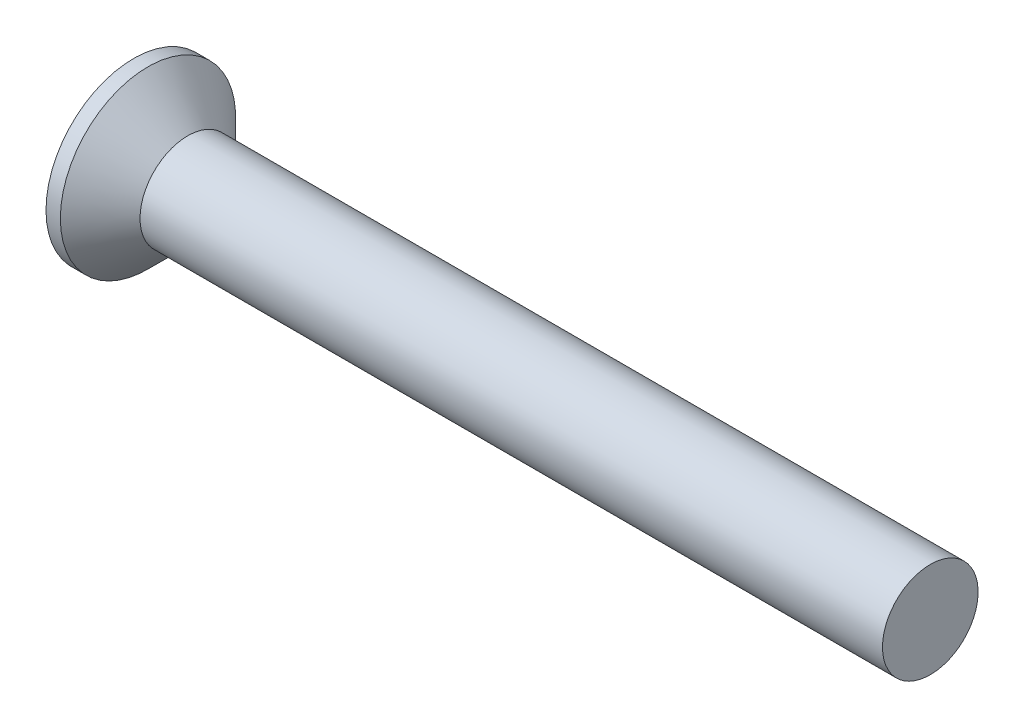
ISO-10303-21;
HEADER;
FILE_DESCRIPTION(('STEP AP214'),'2;1');
FILE_NAME('part.step','',(''),(''),'','','');
FILE_SCHEMA(('AUTOMOTIVE_DESIGN { 1 0 10303 214 1 1 1 1 }'));
ENDSEC;
DATA;
#1=APPLICATION_CONTEXT('core data for automotive mechanical design processes');
#2=APPLICATION_PROTOCOL_DEFINITION('international standard','automotive_design',2000,#1);
#3=PRODUCT_CONTEXT('',#1,'mechanical');
#4=PRODUCT('Part','Part','',(#3));
#5=PRODUCT_RELATED_PRODUCT_CATEGORY('part','',(#4));
#6=PRODUCT_DEFINITION_FORMATION('','',#4);
#7=PRODUCT_DEFINITION_CONTEXT('part definition',#1,'design');
#8=PRODUCT_DEFINITION('design','',#6,#7);
#9=PRODUCT_DEFINITION_SHAPE('','',#8);
#10=(LENGTH_UNIT() NAMED_UNIT(*) SI_UNIT(.MILLI.,.METRE.));
#11=(NAMED_UNIT(*) PLANE_ANGLE_UNIT() SI_UNIT($,.RADIAN.));
#12=(NAMED_UNIT(*) SI_UNIT($,.STERADIAN.) SOLID_ANGLE_UNIT());
#13=UNCERTAINTY_MEASURE_WITH_UNIT(LENGTH_MEASURE(1.E-05),#10,'distance_accuracy_value','');
#14=(GEOMETRIC_REPRESENTATION_CONTEXT(3) GLOBAL_UNCERTAINTY_ASSIGNED_CONTEXT((#13)) GLOBAL_UNIT_ASSIGNED_CONTEXT((#10,
#11,#12)) REPRESENTATION_CONTEXT('',''));
#15=CARTESIAN_POINT('',(0.,0.,0.));
#16=DIRECTION('',(0.,0.,1.));
#17=DIRECTION('',(1.,0.,0.));
#18=AXIS2_PLACEMENT_3D('',#15,#16,#17);
#19=CARTESIAN_POINT('',(0.,0.,0.));
#20=DIRECTION('',(-1.,0.,0.));
#21=DIRECTION('',(0.,0.,1.));
#22=AXIS2_PLACEMENT_3D('',#19,#20,#21);
#23=PLANE('',#22);
#24=CARTESIAN_POINT('',(0.,0.,0.));
#25=DIRECTION('',(-1.,0.,0.));
#26=DIRECTION('',(0.,0.,1.));
#27=AXIS2_PLACEMENT_3D('',#24,#25,#26);
#28=CIRCLE('',#27,2.75);
#29=CARTESIAN_POINT('',(0.,0.,2.75));
#30=VERTEX_POINT('',#29);
#31=EDGE_CURVE('E128',#30,#30,#28,.T.);
#32=ORIENTED_EDGE('',*,*,#31,.T.);
#33=EDGE_LOOP('',(#32));
#34=FACE_BOUND('',#33,.T.);
#35=DIRECTION('',(0.,1.,0.));
#36=VECTOR('',#35,1.);
#37=CARTESIAN_POINT('',(0.,-1.55,-0.395));
#38=LINE('',#37,#36);
#39=CARTESIAN_POINT('',(0.,-1.55,-0.395));
#40=VERTEX_POINT('',#39);
#41=CARTESIAN_POINT('',(0.,-0.394999999999999,-0.395));
#42=VERTEX_POINT('',#41);
#43=EDGE_CURVE('E103',#40,#42,#38,.T.);
#44=ORIENTED_EDGE('',*,*,#43,.T.);
#45=DIRECTION('',(0.,0.,-1.));
#46=VECTOR('',#45,1.);
#47=CARTESIAN_POINT('',(0.,-0.395000000000005,1.55));
#48=LINE('',#47,#46);
#49=CARTESIAN_POINT('',(0.,-0.394999999999995,-1.55));
#50=VERTEX_POINT('',#49);
#51=EDGE_CURVE('E83',#42,#50,#48,.T.);
#52=ORIENTED_EDGE('',*,*,#51,.T.);
#53=DIRECTION('',(0.,1.,0.));
#54=VECTOR('',#53,1.);
#55=CARTESIAN_POINT('',(0.,-0.394999999999995,-1.55));
#56=LINE('',#55,#54);
#57=CARTESIAN_POINT('',(0.,0.395000000000005,-1.55));
#58=VERTEX_POINT('',#57);
#59=EDGE_CURVE('E328',#50,#58,#56,.T.);
#60=ORIENTED_EDGE('',*,*,#59,.T.);
#61=DIRECTION('',(0.,0.,1.));
#62=VECTOR('',#61,1.);
#63=CARTESIAN_POINT('',(0.,0.395000000000005,-1.55));
#64=LINE('',#63,#62);
#65=CARTESIAN_POINT('',(0.,0.395000000000001,-0.395));
#66=VERTEX_POINT('',#65);
#67=EDGE_CURVE('E99',#58,#66,#64,.T.);
#68=ORIENTED_EDGE('',*,*,#67,.T.);
#69=CARTESIAN_POINT('',(0.,1.55,-0.395));
#70=VERTEX_POINT('',#69);
#71=EDGE_CURVE('E93',#66,#70,#38,.T.);
#72=ORIENTED_EDGE('',*,*,#71,.T.);
#73=DIRECTION('',(0.,0.,1.));
#74=VECTOR('',#73,1.);
#75=CARTESIAN_POINT('',(0.,1.55,-0.395));
#76=LINE('',#75,#74);
#77=CARTESIAN_POINT('',(0.,1.55,0.395));
#78=VERTEX_POINT('',#77);
#79=EDGE_CURVE('E96',#70,#78,#76,.T.);
#80=ORIENTED_EDGE('',*,*,#79,.T.);
#81=DIRECTION('',(0.,-1.,0.));
#82=VECTOR('',#81,1.);
#83=CARTESIAN_POINT('',(0.,1.55,0.395));
#84=LINE('',#83,#82);
#85=CARTESIAN_POINT('',(0.,0.394999999999998,0.395));
#86=VERTEX_POINT('',#85);
#87=EDGE_CURVE('E320',#78,#86,#84,.T.);
#88=ORIENTED_EDGE('',*,*,#87,.T.);
#89=CARTESIAN_POINT('',(0.,0.394999999999994,1.55));
#90=VERTEX_POINT('',#89);
#91=EDGE_CURVE('E338',#86,#90,#64,.T.);
#92=ORIENTED_EDGE('',*,*,#91,.T.);
#93=DIRECTION('',(0.,-1.,0.));
#94=VECTOR('',#93,1.);
#95=CARTESIAN_POINT('',(0.,0.394999999999994,1.55));
#96=LINE('',#95,#94);
#97=CARTESIAN_POINT('',(0.,-0.395000000000005,1.55));
#98=VERTEX_POINT('',#97);
#99=EDGE_CURVE('E340',#90,#98,#96,.T.);
#100=ORIENTED_EDGE('',*,*,#99,.T.);
#101=CARTESIAN_POINT('',(0.,-0.395000000000001,0.395));
#102=VERTEX_POINT('',#101);
#103=EDGE_CURVE('E342',#98,#102,#48,.T.);
#104=ORIENTED_EDGE('',*,*,#103,.T.);
#105=CARTESIAN_POINT('',(0.,-1.55,0.395));
#106=VERTEX_POINT('',#105);
#107=EDGE_CURVE('E109',#102,#106,#84,.T.);
#108=ORIENTED_EDGE('',*,*,#107,.T.);
#109=DIRECTION('',(0.,0.,-1.));
#110=VECTOR('',#109,1.);
#111=CARTESIAN_POINT('',(0.,-1.55,0.395));
#112=LINE('',#111,#110);
#113=EDGE_CURVE('E132',#106,#40,#112,.T.);
#114=ORIENTED_EDGE('',*,*,#113,.T.);
#115=EDGE_LOOP('',(#44,#52,#60,#68,#72,#80,#88,#92,#100,#104,#108,#114));
#116=FACE_BOUND('',#115,.T.);
#117=ADVANCED_FACE('F34',(#34,#116),#23,.T.);
#118=CARTESIAN_POINT('',(2.38373382624769,0.,0.16865988909427));
#119=DIRECTION('',(-0.0945267588569115,0.,-0.995522321125954));
#120=DIRECTION('',(-0.995522321125954,0.,0.0945267588569115));
#121=AXIS2_PLACEMENT_3D('',#118,#119,#120);
#122=PLANE('',#121);
#123=ORIENTED_EDGE('',*,*,#107,.F.);
#124=DIRECTION('',(0.991104257398676,0.0941072552097304,-0.0941072552097301));
#125=VECTOR('',#124,1.);
#126=CARTESIAN_POINT('',(2.39946475118715,-0.16716620751949,0.167166207519489));
#127=LINE('',#126,#125);
#128=CARTESIAN_POINT('',(2.08,-0.197500000000001,0.197499999999999));
#129=VERTEX_POINT('',#128);
#130=EDGE_CURVE('E127',#102,#129,#127,.T.);
#131=ORIENTED_EDGE('',*,*,#130,.T.);
#132=DIRECTION('',(0.835707904588477,0.543411029305728,-0.0793520726712617));
#133=VECTOR('',#132,1.);
#134=CARTESIAN_POINT('',(0.,-1.55,0.395));
#135=LINE('',#134,#133);
#136=EDGE_CURVE('E104',#106,#129,#135,.T.);
#137=ORIENTED_EDGE('',*,*,#136,.F.);
#138=EDGE_LOOP('',(#123,#131,#137));
#139=FACE_BOUND('',#138,.T.);
#140=ADVANCED_FACE('F152',(#139),#122,.T.);
#141=DIRECTION('',(0.835707904588477,-0.543411029305729,-0.0793520726712616));
#142=VECTOR('',#141,1.);
#143=CARTESIAN_POINT('',(0.,1.55,0.395));
#144=LINE('',#143,#142);
#145=CARTESIAN_POINT('',(2.08,0.1975,0.1975));
#146=VERTEX_POINT('',#145);
#147=EDGE_CURVE('E49',#78,#146,#144,.T.);
#148=ORIENTED_EDGE('',*,*,#147,.T.);
#149=DIRECTION('',(-0.991104257398676,0.0941072552097297,0.09410725520973));
#150=VECTOR('',#149,1.);
#151=CARTESIAN_POINT('',(2.39946475118715,0.167166207519489,0.167166207519489));
#152=LINE('',#151,#150);
#153=EDGE_CURVE('E324',#146,#86,#152,.T.);
#154=ORIENTED_EDGE('',*,*,#153,.T.);
#155=ORIENTED_EDGE('',*,*,#87,.F.);
#156=EDGE_LOOP('',(#148,#154,#155));
#157=FACE_BOUND('',#156,.T.);
#158=ADVANCED_FACE('F158',(#157),#122,.T.);
#159=CARTESIAN_POINT('',(2.38373382624769,0.,-0.16865988909427));
#160=DIRECTION('',(-0.0945267588569114,0.,0.995522321125954));
#161=DIRECTION('',(0.995522321125954,0.,0.0945267588569114));
#162=AXIS2_PLACEMENT_3D('',#159,#160,#161);
#163=PLANE('',#162);
#164=DIRECTION('',(0.835707904588477,0.543411029305729,0.0793520726712616));
#165=VECTOR('',#164,1.);
#166=CARTESIAN_POINT('',(0.,-1.55,-0.395));
#167=LINE('',#166,#165);
#168=CARTESIAN_POINT('',(2.08,-0.197499999999999,-0.197500000000001));
#169=VERTEX_POINT('',#168);
#170=EDGE_CURVE('E58',#40,#169,#167,.T.);
#171=ORIENTED_EDGE('',*,*,#170,.T.);
#172=DIRECTION('',(-0.991104257398676,-0.0941072552097297,-0.09410725520973));
#173=VECTOR('',#172,1.);
#174=CARTESIAN_POINT('',(2.39946475118715,-0.167166207519489,-0.167166207519489));
#175=LINE('',#174,#173);
#176=EDGE_CURVE('E11',#169,#42,#175,.T.);
#177=ORIENTED_EDGE('',*,*,#176,.T.);
#178=ORIENTED_EDGE('',*,*,#43,.F.);
#179=EDGE_LOOP('',(#171,#177,#178));
#180=FACE_BOUND('',#179,.T.);
#181=ADVANCED_FACE('F149',(#180),#163,.T.);
#182=ORIENTED_EDGE('',*,*,#71,.F.);
#183=DIRECTION('',(0.991104257398676,-0.0941072552097303,0.09410725520973));
#184=VECTOR('',#183,1.);
#185=CARTESIAN_POINT('',(2.39946475118715,0.16716620751949,-0.167166207519489));
#186=LINE('',#185,#184);
#187=CARTESIAN_POINT('',(2.08,0.1975,-0.1975));
#188=VERTEX_POINT('',#187);
#189=EDGE_CURVE('E112',#66,#188,#186,.T.);
#190=ORIENTED_EDGE('',*,*,#189,.T.);
#191=DIRECTION('',(0.835707904588477,-0.543411029305729,0.0793520726712616));
#192=VECTOR('',#191,1.);
#193=CARTESIAN_POINT('',(0.,1.55,-0.395));
#194=LINE('',#193,#192);
#195=EDGE_CURVE('E108',#70,#188,#194,.T.);
#196=ORIENTED_EDGE('',*,*,#195,.F.);
#197=EDGE_LOOP('',(#182,#190,#196));
#198=FACE_BOUND('',#197,.T.);
#199=ADVANCED_FACE('F111',(#198),#163,.T.);
#200=CARTESIAN_POINT('',(25.,1.5,0.));
#201=DIRECTION('',(1.,0.,0.));
#202=DIRECTION('',(0.,0.,-1.));
#203=AXIS2_PLACEMENT_3D('',#200,#201,#202);
#204=PLANE('',#203);
#205=CARTESIAN_POINT('',(25.,0.,0.));
#206=DIRECTION('',(-1.,0.,0.));
#207=DIRECTION('',(0.,0.,1.));
#208=AXIS2_PLACEMENT_3D('',#205,#206,#207);
#209=CIRCLE('',#208,1.5);
#210=CARTESIAN_POINT('',(25.,0.,1.5));
#211=VERTEX_POINT('',#210);
#212=EDGE_CURVE('E42',#211,#211,#209,.T.);
#213=ORIENTED_EDGE('',*,*,#212,.F.);
#214=EDGE_LOOP('',(#213));
#215=FACE_BOUND('',#214,.T.);
#216=ADVANCED_FACE('F36',(#215),#204,.T.);
#217=CARTESIAN_POINT('',(-6.34999999999999,0.,0.));
#218=DIRECTION('',(-1.,0.,0.));
#219=DIRECTION('',(0.,0.,1.));
#220=AXIS2_PLACEMENT_3D('',#217,#218,#219);
#221=CYLINDRICAL_SURFACE('',#220,1.5);
#222=ORIENTED_EDGE('',*,*,#212,.T.);
#223=EDGE_LOOP('',(#222));
#224=FACE_BOUND('',#223,.T.);
#225=CARTESIAN_POINT('',(1.7,0.,0.));
#226=DIRECTION('',(-1.,0.,0.));
#227=DIRECTION('',(0.,0.,1.));
#228=AXIS2_PLACEMENT_3D('',#225,#226,#227);
#229=CIRCLE('',#228,1.5);
#230=CARTESIAN_POINT('',(1.7,0.,1.5));
#231=VERTEX_POINT('',#230);
#232=EDGE_CURVE('E135',#231,#231,#229,.T.);
#233=ORIENTED_EDGE('',*,*,#232,.F.);
#234=EDGE_LOOP('',(#233));
#235=FACE_BOUND('',#234,.T.);
#236=ADVANCED_FACE('F140',(#224,#235),#221,.T.);
#237=CARTESIAN_POINT('',(0.450000000000005,0.,0.));
#238=DIRECTION('',(-1.,0.,0.));
#239=DIRECTION('',(0.,0.,1.));
#240=AXIS2_PLACEMENT_3D('',#237,#238,#239);
#241=CONICAL_SURFACE('',#240,2.75,0.78539816339745);
#242=ORIENTED_EDGE('',*,*,#232,.T.);
#243=EDGE_LOOP('',(#242));
#244=FACE_BOUND('',#243,.T.);
#245=CARTESIAN_POINT('',(0.450000000000005,0.,0.));
#246=DIRECTION('',(-1.,0.,0.));
#247=DIRECTION('',(0.,0.,1.));
#248=AXIS2_PLACEMENT_3D('',#245,#246,#247);
#249=CIRCLE('',#248,2.75);
#250=CARTESIAN_POINT('',(0.450000000000005,0.,2.75));
#251=VERTEX_POINT('',#250);
#252=EDGE_CURVE('E131',#251,#251,#249,.T.);
#253=ORIENTED_EDGE('',*,*,#252,.F.);
#254=EDGE_LOOP('',(#253));
#255=FACE_BOUND('',#254,.T.);
#256=ADVANCED_FACE('F148',(#244,#255),#241,.T.);
#257=CARTESIAN_POINT('',(-6.34999999999999,0.,0.));
#258=DIRECTION('',(-1.,0.,0.));
#259=DIRECTION('',(0.,0.,1.));
#260=AXIS2_PLACEMENT_3D('',#257,#258,#259);
#261=CYLINDRICAL_SURFACE('',#260,2.75);
#262=ORIENTED_EDGE('',*,*,#252,.T.);
#263=EDGE_LOOP('',(#262));
#264=FACE_BOUND('',#263,.T.);
#265=ORIENTED_EDGE('',*,*,#31,.F.);
#266=EDGE_LOOP('',(#265));
#267=FACE_BOUND('',#266,.T.);
#268=ADVANCED_FACE('F165',(#264,#267),#261,.T.);
#269=CARTESIAN_POINT('',(2.08,0.1975,-0.1975));
#270=DIRECTION('',(1.,0.,0.));
#271=DIRECTION('',(0.,0.,-1.));
#272=AXIS2_PLACEMENT_3D('',#269,#270,#271);
#273=PLANE('',#272);
#274=DIRECTION('',(0.,1.,0.));
#275=VECTOR('',#274,1.);
#276=CARTESIAN_POINT('',(2.08,-0.1975,-0.1975));
#277=LINE('',#276,#275);
#278=EDGE_CURVE('E123',#169,#188,#277,.T.);
#279=ORIENTED_EDGE('',*,*,#278,.F.);
#280=DIRECTION('',(0.,0.,-1.));
#281=VECTOR('',#280,1.);
#282=CARTESIAN_POINT('',(2.08,-0.1975,0.1975));
#283=LINE('',#282,#281);
#284=EDGE_CURVE('E114',#129,#169,#283,.T.);
#285=ORIENTED_EDGE('',*,*,#284,.F.);
#286=DIRECTION('',(0.,-1.,0.));
#287=VECTOR('',#286,1.);
#288=CARTESIAN_POINT('',(2.08,0.1975,0.1975));
#289=LINE('',#288,#287);
#290=EDGE_CURVE('E117',#146,#129,#289,.T.);
#291=ORIENTED_EDGE('',*,*,#290,.F.);
#292=DIRECTION('',(0.,0.,1.));
#293=VECTOR('',#292,1.);
#294=CARTESIAN_POINT('',(2.08,0.1975,-0.1975));
#295=LINE('',#294,#293);
#296=EDGE_CURVE('E121',#188,#146,#295,.T.);
#297=ORIENTED_EDGE('',*,*,#296,.F.);
#298=EDGE_LOOP('',(#279,#285,#291,#297));
#299=FACE_BOUND('',#298,.T.);
#300=ADVANCED_FACE('F163',(#299),#273,.F.);
#301=CARTESIAN_POINT('',(0.,-1.55,-0.395));
#302=DIRECTION('',(-0.54513001368185,0.838351518268576,0.));
#303=DIRECTION('',(-0.838351518268576,-0.54513001368185,0.));
#304=AXIS2_PLACEMENT_3D('',#301,#302,#303);
#305=PLANE('',#304);
#306=ORIENTED_EDGE('',*,*,#170,.F.);
#307=ORIENTED_EDGE('',*,*,#113,.F.);
#308=ORIENTED_EDGE('',*,*,#136,.T.);
#309=ORIENTED_EDGE('',*,*,#284,.T.);
#310=EDGE_LOOP('',(#306,#307,#308,#309));
#311=FACE_BOUND('',#310,.T.);
#312=ADVANCED_FACE('F191',(#311),#305,.T.);
#313=CARTESIAN_POINT('',(0.,1.55,0.395));
#314=DIRECTION('',(-0.54513001368185,-0.838351518268576,0.));
#315=DIRECTION('',(0.838351518268576,-0.54513001368185,0.));
#316=AXIS2_PLACEMENT_3D('',#313,#314,#315);
#317=PLANE('',#316);
#318=ORIENTED_EDGE('',*,*,#147,.F.);
#319=ORIENTED_EDGE('',*,*,#79,.F.);
#320=ORIENTED_EDGE('',*,*,#195,.T.);
#321=ORIENTED_EDGE('',*,*,#296,.T.);
#322=EDGE_LOOP('',(#318,#319,#320,#321));
#323=FACE_BOUND('',#322,.T.);
#324=ADVANCED_FACE('F107',(#323),#317,.T.);
#325=CARTESIAN_POINT('',(2.38373382624769,-0.16865988909427,0.));
#326=DIRECTION('',(-0.0945267588569115,0.995522321125954,0.));
#327=DIRECTION('',(-0.995522321125954,-0.0945267588569115,0.));
#328=AXIS2_PLACEMENT_3D('',#325,#326,#327);
#329=PLANE('',#328);
#330=DIRECTION('',(0.835707904588477,0.0793520726712598,0.543411029305729));
#331=VECTOR('',#330,1.);
#332=CARTESIAN_POINT('',(0.,-0.394999999999995,-1.55));
#333=LINE('',#332,#331);
#334=EDGE_CURVE('E335',#50,#169,#333,.T.);
#335=ORIENTED_EDGE('',*,*,#334,.F.);
#336=ORIENTED_EDGE('',*,*,#51,.F.);
#337=ORIENTED_EDGE('',*,*,#176,.F.);
#338=EDGE_LOOP('',(#335,#336,#337));
#339=FACE_BOUND('',#338,.T.);
#340=ADVANCED_FACE('F205',(#339),#329,.T.);
#341=CARTESIAN_POINT('',(2.38373382624769,0.16865988909427,0.));
#342=DIRECTION('',(-0.0945267588569114,-0.995522321125954,0.));
#343=DIRECTION('',(0.995522321125954,-0.0945267588569114,0.));
#344=AXIS2_PLACEMENT_3D('',#341,#342,#343);
#345=PLANE('',#344);
#346=ORIENTED_EDGE('',*,*,#67,.F.);
#347=DIRECTION('',(0.835707904588477,-0.0793520726712635,0.543411029305728));
#348=VECTOR('',#347,1.);
#349=CARTESIAN_POINT('',(0.,0.395000000000005,-1.55));
#350=LINE('',#349,#348);
#351=EDGE_CURVE('E74',#58,#188,#350,.T.);
#352=ORIENTED_EDGE('',*,*,#351,.T.);
#353=ORIENTED_EDGE('',*,*,#189,.F.);
#354=EDGE_LOOP('',(#346,#352,#353));
#355=FACE_BOUND('',#354,.T.);
#356=ADVANCED_FACE('F211',(#355),#345,.T.);
#357=CARTESIAN_POINT('',(0.,0.395000000000005,-1.55));
#358=DIRECTION('',(-0.54513001368185,0.,0.838351518268576));
#359=DIRECTION('',(-0.838351518268576,0.,-0.54513001368185));
#360=AXIS2_PLACEMENT_3D('',#357,#358,#359);
#361=PLANE('',#360);
#362=ORIENTED_EDGE('',*,*,#351,.F.);
#363=ORIENTED_EDGE('',*,*,#59,.F.);
#364=ORIENTED_EDGE('',*,*,#334,.T.);
#365=ORIENTED_EDGE('',*,*,#278,.T.);
#366=EDGE_LOOP('',(#362,#363,#364,#365));
#367=FACE_BOUND('',#366,.T.);
#368=ADVANCED_FACE('F219',(#367),#361,.T.);
#369=ORIENTED_EDGE('',*,*,#103,.F.);
#370=DIRECTION('',(0.835707904588477,0.0793520726712635,-0.543411029305728));
#371=VECTOR('',#370,1.);
#372=CARTESIAN_POINT('',(0.,-0.395000000000005,1.55));
#373=LINE('',#372,#371);
#374=EDGE_CURVE('E331',#98,#129,#373,.T.);
#375=ORIENTED_EDGE('',*,*,#374,.T.);
#376=ORIENTED_EDGE('',*,*,#130,.F.);
#377=EDGE_LOOP('',(#369,#375,#376));
#378=FACE_BOUND('',#377,.T.);
#379=ADVANCED_FACE('F213',(#378),#329,.T.);
#380=DIRECTION('',(0.835707904588477,-0.0793520726712597,-0.543411029305729));
#381=VECTOR('',#380,1.);
#382=CARTESIAN_POINT('',(0.,0.394999999999994,1.55));
#383=LINE('',#382,#381);
#384=EDGE_CURVE('E329',#90,#146,#383,.T.);
#385=ORIENTED_EDGE('',*,*,#384,.F.);
#386=ORIENTED_EDGE('',*,*,#91,.F.);
#387=ORIENTED_EDGE('',*,*,#153,.F.);
#388=EDGE_LOOP('',(#385,#386,#387));
#389=FACE_BOUND('',#388,.T.);
#390=ADVANCED_FACE('F221',(#389),#345,.T.);
#391=CARTESIAN_POINT('',(0.,-0.395000000000005,1.55));
#392=DIRECTION('',(-0.54513001368185,0.,-0.838351518268576));
#393=DIRECTION('',(0.838351518268576,0.,-0.54513001368185));
#394=AXIS2_PLACEMENT_3D('',#391,#392,#393);
#395=PLANE('',#394);
#396=ORIENTED_EDGE('',*,*,#374,.F.);
#397=ORIENTED_EDGE('',*,*,#99,.F.);
#398=ORIENTED_EDGE('',*,*,#384,.T.);
#399=ORIENTED_EDGE('',*,*,#290,.T.);
#400=EDGE_LOOP('',(#396,#397,#398,#399));
#401=FACE_BOUND('',#400,.T.);
#402=ADVANCED_FACE('F240',(#401),#395,.T.);
#403=CLOSED_SHELL('',(#117,#140,#158,#181,#199,#216,#236,#256,#268,#300,#312,#324,#340,#356,
#368,#379,#390,#402));
#404=MANIFOLD_SOLID_BREP('B2',#403);
#405=ADVANCED_BREP_SHAPE_REPRESENTATION('',(#18,#404),#14);
#406=SHAPE_DEFINITION_REPRESENTATION(#9,#405);
ENDSEC;
END-ISO-10303-21;
